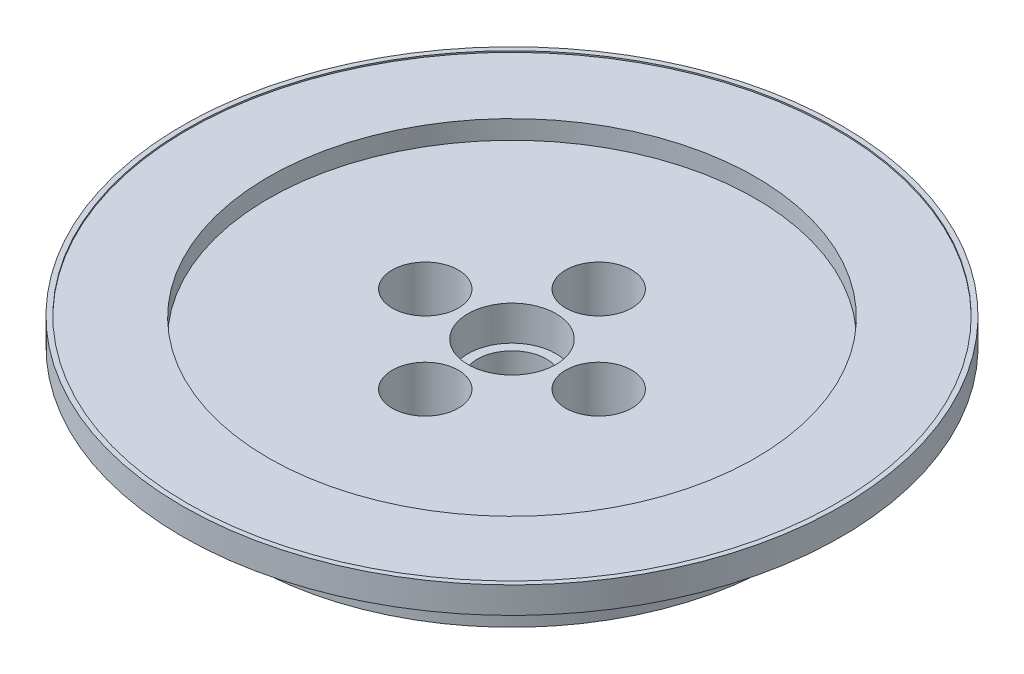
ISO-10303-21;
HEADER;
FILE_DESCRIPTION(('STEP AP214'),'2;1');
FILE_NAME('part.step','',(''),(''),'','','');
FILE_SCHEMA(('AUTOMOTIVE_DESIGN { 1 0 10303 214 1 1 1 1 }'));
ENDSEC;
DATA;
#1=APPLICATION_CONTEXT('core data for automotive mechanical design processes');
#2=APPLICATION_PROTOCOL_DEFINITION('international standard','automotive_design',2000,#1);
#3=PRODUCT_CONTEXT('',#1,'mechanical');
#4=PRODUCT('Part','Part','',(#3));
#5=PRODUCT_RELATED_PRODUCT_CATEGORY('part','',(#4));
#6=PRODUCT_DEFINITION_FORMATION('','',#4);
#7=PRODUCT_DEFINITION_CONTEXT('part definition',#1,'design');
#8=PRODUCT_DEFINITION('design','',#6,#7);
#9=PRODUCT_DEFINITION_SHAPE('','',#8);
#10=(LENGTH_UNIT() NAMED_UNIT(*) SI_UNIT(.MILLI.,.METRE.));
#11=(NAMED_UNIT(*) PLANE_ANGLE_UNIT() SI_UNIT($,.RADIAN.));
#12=(NAMED_UNIT(*) SI_UNIT($,.STERADIAN.) SOLID_ANGLE_UNIT());
#13=UNCERTAINTY_MEASURE_WITH_UNIT(LENGTH_MEASURE(1.E-05),#10,'distance_accuracy_value','');
#14=(GEOMETRIC_REPRESENTATION_CONTEXT(3) GLOBAL_UNCERTAINTY_ASSIGNED_CONTEXT((#13)) GLOBAL_UNIT_ASSIGNED_CONTEXT((#10,
#11,#12)) REPRESENTATION_CONTEXT('',''));
#15=CARTESIAN_POINT('',(0.,0.,0.));
#16=DIRECTION('',(0.,0.,1.));
#17=DIRECTION('',(1.,0.,0.));
#18=AXIS2_PLACEMENT_3D('',#15,#16,#17);
#19=CARTESIAN_POINT('',(0.,0.,0.));
#20=DIRECTION('',(0.,1.,0.));
#21=DIRECTION('',(0.,0.,1.));
#22=AXIS2_PLACEMENT_3D('',#19,#20,#21);
#23=CYLINDRICAL_SURFACE('',#22,46.798);
#24=CARTESIAN_POINT('',(0.,0.,0.));
#25=DIRECTION('',(0.,1.,0.));
#26=DIRECTION('',(0.,0.,1.));
#27=AXIS2_PLACEMENT_3D('',#24,#25,#26);
#28=CIRCLE('',#27,46.798);
#29=CARTESIAN_POINT('',(0.,0.,46.798));
#30=VERTEX_POINT('',#29);
#31=EDGE_CURVE('E18',#30,#30,#28,.F.);
#32=ORIENTED_EDGE('',*,*,#31,.F.);
#33=EDGE_LOOP('',(#32));
#34=FACE_BOUND('',#33,.T.);
#35=CARTESIAN_POINT('',(0.,-0.2,0.));
#36=DIRECTION('',(0.,1.,0.));
#37=DIRECTION('',(0.,0.,1.));
#38=AXIS2_PLACEMENT_3D('',#35,#36,#37);
#39=CIRCLE('',#38,46.798);
#40=CARTESIAN_POINT('',(0.,-0.2,46.798));
#41=VERTEX_POINT('',#40);
#42=EDGE_CURVE('E74',#41,#41,#39,.T.);
#43=ORIENTED_EDGE('',*,*,#42,.F.);
#44=EDGE_LOOP('',(#43));
#45=FACE_BOUND('',#44,.T.);
#46=ADVANCED_FACE('F15',(#34,#45),#23,.F.);
#47=CARTESIAN_POINT('',(0.,0.,0.));
#48=DIRECTION('',(0.,1.,0.));
#49=DIRECTION('',(0.,0.,1.));
#50=AXIS2_PLACEMENT_3D('',#47,#48,#49);
#51=PLANE('',#50);
#52=ORIENTED_EDGE('',*,*,#31,.T.);
#53=EDGE_LOOP('',(#52));
#54=FACE_BOUND('',#53,.T.);
#55=CARTESIAN_POINT('',(0.,0.,0.));
#56=DIRECTION('',(0.,1.,0.));
#57=DIRECTION('',(0.,0.,1.));
#58=AXIS2_PLACEMENT_3D('',#55,#56,#57);
#59=CIRCLE('',#58,47.498);
#60=CARTESIAN_POINT('',(0.,0.,47.498));
#61=VERTEX_POINT('',#60);
#62=EDGE_CURVE('E72',#61,#61,#59,.F.);
#63=ORIENTED_EDGE('',*,*,#62,.F.);
#64=EDGE_LOOP('',(#63));
#65=FACE_BOUND('',#64,.T.);
#66=ADVANCED_FACE('F81',(#54,#65),#51,.T.);
#67=CARTESIAN_POINT('',(0.,-0.2,0.));
#68=DIRECTION('',(0.,1.,0.));
#69=DIRECTION('',(0.,0.,1.));
#70=AXIS2_PLACEMENT_3D('',#67,#68,#69);
#71=PLANE('',#70);
#72=CARTESIAN_POINT('',(0.,-0.2,0.));
#73=DIRECTION('',(0.,1.,0.));
#74=DIRECTION('',(0.,0.,1.));
#75=AXIS2_PLACEMENT_3D('',#72,#73,#74);
#76=CIRCLE('',#75,35.1);
#77=CARTESIAN_POINT('',(0.,-0.2,35.1));
#78=VERTEX_POINT('',#77);
#79=EDGE_CURVE('E69',#78,#78,#76,.F.);
#80=ORIENTED_EDGE('',*,*,#79,.T.);
#81=EDGE_LOOP('',(#80));
#82=FACE_BOUND('',#81,.T.);
#83=ORIENTED_EDGE('',*,*,#42,.T.);
#84=EDGE_LOOP('',(#83));
#85=FACE_BOUND('',#84,.T.);
#86=ADVANCED_FACE('F90',(#82,#85),#71,.T.);
#87=CARTESIAN_POINT('',(0.,0.,0.));
#88=DIRECTION('',(0.,1.,0.));
#89=DIRECTION('',(0.,0.,1.));
#90=AXIS2_PLACEMENT_3D('',#87,#88,#89);
#91=CYLINDRICAL_SURFACE('',#90,47.498);
#92=ORIENTED_EDGE('',*,*,#62,.T.);
#93=EDGE_LOOP('',(#92));
#94=FACE_BOUND('',#93,.T.);
#95=CARTESIAN_POINT('',(0.,-3.80999999999902,0.));
#96=DIRECTION('',(0.,1.,0.));
#97=DIRECTION('',(0.,0.,-1.));
#98=AXIS2_PLACEMENT_3D('',#95,#96,#97);
#99=CIRCLE('',#98,47.4979999999996);
#100=CARTESIAN_POINT('',(0.,-3.80999999999902,-47.4979999999996));
#101=VERTEX_POINT('',#100);
#102=EDGE_CURVE('E30',#101,#101,#99,.F.);
#103=ORIENTED_EDGE('',*,*,#102,.F.);
#104=EDGE_LOOP('',(#103));
#105=FACE_BOUND('',#104,.T.);
#106=ADVANCED_FACE('F142',(#94,#105),#91,.T.);
#107=CARTESIAN_POINT('',(0.,0.,0.));
#108=DIRECTION('',(0.,1.,0.));
#109=DIRECTION('',(0.,0.,1.));
#110=AXIS2_PLACEMENT_3D('',#107,#108,#109);
#111=CYLINDRICAL_SURFACE('',#110,35.1);
#112=ORIENTED_EDGE('',*,*,#79,.F.);
#113=EDGE_LOOP('',(#112));
#114=FACE_BOUND('',#113,.T.);
#115=CARTESIAN_POINT('',(0.,-2.9,0.));
#116=DIRECTION('',(0.,1.,0.));
#117=DIRECTION('',(0.,0.,1.));
#118=AXIS2_PLACEMENT_3D('',#115,#116,#117);
#119=CIRCLE('',#118,35.1);
#120=CARTESIAN_POINT('',(0.,-2.9,35.1));
#121=VERTEX_POINT('',#120);
#122=EDGE_CURVE('E66',#121,#121,#119,.T.);
#123=ORIENTED_EDGE('',*,*,#122,.F.);
#124=EDGE_LOOP('',(#123));
#125=FACE_BOUND('',#124,.T.);
#126=ADVANCED_FACE('F138',(#114,#125),#111,.F.);
#127=CARTESIAN_POINT('',(0.,-1.396,0.));
#128=DIRECTION('',(0.,-1.,0.));
#129=DIRECTION('',(0.,0.,-1.));
#130=AXIS2_PLACEMENT_3D('',#127,#128,#129);
#131=CYLINDRICAL_SURFACE('',#130,6.35);
#132=CARTESIAN_POINT('',(0.,-7.898,0.));
#133=DIRECTION('',(0.,-1.,0.));
#134=DIRECTION('',(0.,0.,-1.));
#135=AXIS2_PLACEMENT_3D('',#132,#133,#134);
#136=CIRCLE('',#135,6.35);
#137=CARTESIAN_POINT('',(0.,-7.898,-6.35));
#138=VERTEX_POINT('',#137);
#139=EDGE_CURVE('E60',#138,#138,#136,.T.);
#140=ORIENTED_EDGE('',*,*,#139,.T.);
#141=EDGE_LOOP('',(#140));
#142=FACE_BOUND('',#141,.T.);
#143=CARTESIAN_POINT('',(0.,-2.9,0.));
#144=DIRECTION('',(0.,-1.,0.));
#145=DIRECTION('',(0.,0.,-1.));
#146=AXIS2_PLACEMENT_3D('',#143,#144,#145);
#147=CIRCLE('',#146,6.35);
#148=CARTESIAN_POINT('',(0.,-2.9,-6.35));
#149=VERTEX_POINT('',#148);
#150=EDGE_CURVE('E63',#149,#149,#147,.T.);
#151=ORIENTED_EDGE('',*,*,#150,.F.);
#152=EDGE_LOOP('',(#151));
#153=FACE_BOUND('',#152,.T.);
#154=ADVANCED_FACE('F134',(#142,#153),#131,.F.);
#155=CARTESIAN_POINT('',(0.,-3.80999999999902,0.));
#156=DIRECTION('',(0.,1.,0.));
#157=DIRECTION('',(0.,0.,1.));
#158=AXIS2_PLACEMENT_3D('',#155,#156,#157);
#159=CONICAL_SURFACE('',#158,47.4979999999996,1.2217304763958);
#160=ORIENTED_EDGE('',*,*,#102,.T.);
#161=EDGE_LOOP('',(#160));
#162=FACE_BOUND('',#161,.T.);
#163=CARTESIAN_POINT('',(0.,-7.230592261634,0.));
#164=DIRECTION('',(0.,1.,0.));
#165=DIRECTION('',(0.,0.,1.));
#166=AXIS2_PLACEMENT_3D('',#163,#164,#165);
#167=CIRCLE('',#166,38.1);
#168=CARTESIAN_POINT('',(0.,-7.230592261634,38.1));
#169=VERTEX_POINT('',#168);
#170=EDGE_CURVE('E59',#169,#169,#167,.F.);
#171=ORIENTED_EDGE('',*,*,#170,.F.);
#172=EDGE_LOOP('',(#171));
#173=FACE_BOUND('',#172,.T.);
#174=ADVANCED_FACE('F130',(#162,#173),#159,.T.);
#175=CARTESIAN_POINT('',(0.,-2.9,0.));
#176=DIRECTION('',(0.,1.,0.));
#177=DIRECTION('',(0.,0.,1.));
#178=AXIS2_PLACEMENT_3D('',#175,#176,#177);
#179=PLANE('',#178);
#180=ORIENTED_EDGE('',*,*,#150,.T.);
#181=EDGE_LOOP('',(#180));
#182=FACE_BOUND('',#181,.T.);
#183=CARTESIAN_POINT('',(-12.5,-2.9,0.));
#184=DIRECTION('',(0.,1.,0.));
#185=DIRECTION('',(0.,0.,1.));
#186=AXIS2_PLACEMENT_3D('',#183,#184,#185);
#187=CIRCLE('',#186,4.7625);
#188=CARTESIAN_POINT('',(-12.5,-2.9,4.7625));
#189=VERTEX_POINT('',#188);
#190=EDGE_CURVE('E47',#189,#189,#187,.F.);
#191=ORIENTED_EDGE('',*,*,#190,.T.);
#192=EDGE_LOOP('',(#191));
#193=FACE_BOUND('',#192,.T.);
#194=CARTESIAN_POINT('',(0.,-2.9,-12.5));
#195=DIRECTION('',(0.,1.,0.));
#196=DIRECTION('',(0.,0.,1.));
#197=AXIS2_PLACEMENT_3D('',#194,#195,#196);
#198=CIRCLE('',#197,4.7625);
#199=CARTESIAN_POINT('',(0.,-2.9,-7.7375));
#200=VERTEX_POINT('',#199);
#201=EDGE_CURVE('E50',#200,#200,#198,.F.);
#202=ORIENTED_EDGE('',*,*,#201,.T.);
#203=EDGE_LOOP('',(#202));
#204=FACE_BOUND('',#203,.T.);
#205=CARTESIAN_POINT('',(12.5,-2.9,0.));
#206=DIRECTION('',(0.,1.,0.));
#207=DIRECTION('',(0.,0.,1.));
#208=AXIS2_PLACEMENT_3D('',#205,#206,#207);
#209=CIRCLE('',#208,4.7625);
#210=CARTESIAN_POINT('',(12.5,-2.9,4.7625));
#211=VERTEX_POINT('',#210);
#212=EDGE_CURVE('E53',#211,#211,#209,.F.);
#213=ORIENTED_EDGE('',*,*,#212,.T.);
#214=EDGE_LOOP('',(#213));
#215=FACE_BOUND('',#214,.T.);
#216=CARTESIAN_POINT('',(0.,-2.9,12.5));
#217=DIRECTION('',(0.,1.,0.));
#218=DIRECTION('',(0.,0.,1.));
#219=AXIS2_PLACEMENT_3D('',#216,#217,#218);
#220=CIRCLE('',#219,4.7625);
#221=CARTESIAN_POINT('',(0.,-2.9,17.2625));
#222=VERTEX_POINT('',#221);
#223=EDGE_CURVE('E56',#222,#222,#220,.F.);
#224=ORIENTED_EDGE('',*,*,#223,.T.);
#225=EDGE_LOOP('',(#224));
#226=FACE_BOUND('',#225,.T.);
#227=ORIENTED_EDGE('',*,*,#122,.T.);
#228=EDGE_LOOP('',(#227));
#229=FACE_BOUND('',#228,.T.);
#230=ADVANCED_FACE('F126',(#182,#193,#204,#215,#226,#229),#179,.T.);
#231=CARTESIAN_POINT('',(0.,-7.898,0.));
#232=DIRECTION('',(0.,-1.,0.));
#233=DIRECTION('',(0.,0.,-1.));
#234=AXIS2_PLACEMENT_3D('',#231,#232,#233);
#235=PLANE('',#234);
#236=CARTESIAN_POINT('',(0.,-7.898,0.));
#237=DIRECTION('',(0.,-1.,0.));
#238=DIRECTION('',(0.,0.,-1.));
#239=AXIS2_PLACEMENT_3D('',#236,#237,#238);
#240=CIRCLE('',#239,5.);
#241=CARTESIAN_POINT('',(0.,-7.898,-5.));
#242=VERTEX_POINT('',#241);
#243=EDGE_CURVE('E44',#242,#242,#240,.T.);
#244=ORIENTED_EDGE('',*,*,#243,.T.);
#245=EDGE_LOOP('',(#244));
#246=FACE_BOUND('',#245,.T.);
#247=ORIENTED_EDGE('',*,*,#139,.F.);
#248=EDGE_LOOP('',(#247));
#249=FACE_BOUND('',#248,.T.);
#250=ADVANCED_FACE('F122',(#246,#249),#235,.F.);
#251=CARTESIAN_POINT('',(0.,0.,0.));
#252=DIRECTION('',(0.,1.,0.));
#253=DIRECTION('',(0.,0.,1.));
#254=AXIS2_PLACEMENT_3D('',#251,#252,#253);
#255=CYLINDRICAL_SURFACE('',#254,38.1);
#256=ORIENTED_EDGE('',*,*,#170,.T.);
#257=EDGE_LOOP('',(#256));
#258=FACE_BOUND('',#257,.T.);
#259=CARTESIAN_POINT('',(0.,-11.938,0.));
#260=DIRECTION('',(0.,1.,0.));
#261=DIRECTION('',(0.,0.,1.));
#262=AXIS2_PLACEMENT_3D('',#259,#260,#261);
#263=CIRCLE('',#262,38.1);
#264=CARTESIAN_POINT('',(0.,-11.938,38.1));
#265=VERTEX_POINT('',#264);
#266=EDGE_CURVE('E41',#265,#265,#263,.T.);
#267=ORIENTED_EDGE('',*,*,#266,.T.);
#268=EDGE_LOOP('',(#267));
#269=FACE_BOUND('',#268,.T.);
#270=ADVANCED_FACE('F118',(#258,#269),#255,.T.);
#271=CARTESIAN_POINT('',(0.,-11.938,12.5));
#272=DIRECTION('',(0.,1.,0.));
#273=DIRECTION('',(0.,0.,1.));
#274=AXIS2_PLACEMENT_3D('',#271,#272,#273);
#275=CYLINDRICAL_SURFACE('',#274,4.7625);
#276=ORIENTED_EDGE('',*,*,#223,.F.);
#277=EDGE_LOOP('',(#276));
#278=FACE_BOUND('',#277,.T.);
#279=CARTESIAN_POINT('',(0.,-11.938,12.5));
#280=DIRECTION('',(0.,1.,0.));
#281=DIRECTION('',(0.,0.,1.));
#282=AXIS2_PLACEMENT_3D('',#279,#280,#281);
#283=CIRCLE('',#282,4.7625);
#284=CARTESIAN_POINT('',(0.,-11.938,17.2625));
#285=VERTEX_POINT('',#284);
#286=EDGE_CURVE('E38',#285,#285,#283,.F.);
#287=ORIENTED_EDGE('',*,*,#286,.T.);
#288=EDGE_LOOP('',(#287));
#289=FACE_BOUND('',#288,.T.);
#290=ADVANCED_FACE('F114',(#278,#289),#275,.F.);
#291=CARTESIAN_POINT('',(12.5,-11.938,0.));
#292=DIRECTION('',(0.,1.,0.));
#293=DIRECTION('',(0.,0.,1.));
#294=AXIS2_PLACEMENT_3D('',#291,#292,#293);
#295=CYLINDRICAL_SURFACE('',#294,4.7625);
#296=ORIENTED_EDGE('',*,*,#212,.F.);
#297=EDGE_LOOP('',(#296));
#298=FACE_BOUND('',#297,.T.);
#299=CARTESIAN_POINT('',(12.5,-11.938,0.));
#300=DIRECTION('',(0.,1.,0.));
#301=DIRECTION('',(0.,0.,1.));
#302=AXIS2_PLACEMENT_3D('',#299,#300,#301);
#303=CIRCLE('',#302,4.7625);
#304=CARTESIAN_POINT('',(12.5,-11.938,4.7625));
#305=VERTEX_POINT('',#304);
#306=EDGE_CURVE('E35',#305,#305,#303,.F.);
#307=ORIENTED_EDGE('',*,*,#306,.T.);
#308=EDGE_LOOP('',(#307));
#309=FACE_BOUND('',#308,.T.);
#310=ADVANCED_FACE('F110',(#298,#309),#295,.F.);
#311=CARTESIAN_POINT('',(0.,-11.938,-12.5));
#312=DIRECTION('',(0.,1.,0.));
#313=DIRECTION('',(0.,0.,1.));
#314=AXIS2_PLACEMENT_3D('',#311,#312,#313);
#315=CYLINDRICAL_SURFACE('',#314,4.7625);
#316=ORIENTED_EDGE('',*,*,#201,.F.);
#317=EDGE_LOOP('',(#316));
#318=FACE_BOUND('',#317,.T.);
#319=CARTESIAN_POINT('',(0.,-11.938,-12.5));
#320=DIRECTION('',(0.,1.,0.));
#321=DIRECTION('',(0.,0.,1.));
#322=AXIS2_PLACEMENT_3D('',#319,#320,#321);
#323=CIRCLE('',#322,4.7625);
#324=CARTESIAN_POINT('',(0.,-11.938,-7.7375));
#325=VERTEX_POINT('',#324);
#326=EDGE_CURVE('E27',#325,#325,#323,.F.);
#327=ORIENTED_EDGE('',*,*,#326,.T.);
#328=EDGE_LOOP('',(#327));
#329=FACE_BOUND('',#328,.T.);
#330=ADVANCED_FACE('F106',(#318,#329),#315,.F.);
#331=CARTESIAN_POINT('',(-12.5,-11.938,0.));
#332=DIRECTION('',(0.,1.,0.));
#333=DIRECTION('',(0.,0.,1.));
#334=AXIS2_PLACEMENT_3D('',#331,#332,#333);
#335=CYLINDRICAL_SURFACE('',#334,4.7625);
#336=ORIENTED_EDGE('',*,*,#190,.F.);
#337=EDGE_LOOP('',(#336));
#338=FACE_BOUND('',#337,.T.);
#339=CARTESIAN_POINT('',(-12.5,-11.938,0.));
#340=DIRECTION('',(0.,1.,0.));
#341=DIRECTION('',(0.,0.,1.));
#342=AXIS2_PLACEMENT_3D('',#339,#340,#341);
#343=CIRCLE('',#342,4.7625);
#344=CARTESIAN_POINT('',(-12.5,-11.938,4.7625));
#345=VERTEX_POINT('',#344);
#346=EDGE_CURVE('E22',#345,#345,#343,.F.);
#347=ORIENTED_EDGE('',*,*,#346,.T.);
#348=EDGE_LOOP('',(#347));
#349=FACE_BOUND('',#348,.T.);
#350=ADVANCED_FACE('F99',(#338,#349),#335,.F.);
#351=CARTESIAN_POINT('',(0.,-1.396,0.));
#352=DIRECTION('',(0.,-1.,0.));
#353=DIRECTION('',(0.,0.,-1.));
#354=AXIS2_PLACEMENT_3D('',#351,#352,#353);
#355=CYLINDRICAL_SURFACE('',#354,5.);
#356=ORIENTED_EDGE('',*,*,#243,.F.);
#357=EDGE_LOOP('',(#356));
#358=FACE_BOUND('',#357,.T.);
#359=CARTESIAN_POINT('',(0.,-11.938,0.));
#360=DIRECTION('',(0.,-1.,0.));
#361=DIRECTION('',(0.,0.,-1.));
#362=AXIS2_PLACEMENT_3D('',#359,#360,#361);
#363=CIRCLE('',#362,5.);
#364=CARTESIAN_POINT('',(0.,-11.938,-5.));
#365=VERTEX_POINT('',#364);
#366=EDGE_CURVE('E10',#365,#365,#363,.T.);
#367=ORIENTED_EDGE('',*,*,#366,.T.);
#368=EDGE_LOOP('',(#367));
#369=FACE_BOUND('',#368,.T.);
#370=ADVANCED_FACE('F93',(#358,#369),#355,.F.);
#371=CARTESIAN_POINT('',(0.,-11.938,0.));
#372=DIRECTION('',(0.,1.,0.));
#373=DIRECTION('',(0.,0.,1.));
#374=AXIS2_PLACEMENT_3D('',#371,#372,#373);
#375=PLANE('',#374);
#376=ORIENTED_EDGE('',*,*,#366,.F.);
#377=EDGE_LOOP('',(#376));
#378=FACE_BOUND('',#377,.T.);
#379=ORIENTED_EDGE('',*,*,#346,.F.);
#380=EDGE_LOOP('',(#379));
#381=FACE_BOUND('',#380,.T.);
#382=ORIENTED_EDGE('',*,*,#326,.F.);
#383=EDGE_LOOP('',(#382));
#384=FACE_BOUND('',#383,.T.);
#385=ORIENTED_EDGE('',*,*,#306,.F.);
#386=EDGE_LOOP('',(#385));
#387=FACE_BOUND('',#386,.T.);
#388=ORIENTED_EDGE('',*,*,#286,.F.);
#389=EDGE_LOOP('',(#388));
#390=FACE_BOUND('',#389,.T.);
#391=ORIENTED_EDGE('',*,*,#266,.F.);
#392=EDGE_LOOP('',(#391));
#393=FACE_BOUND('',#392,.T.);
#394=ADVANCED_FACE('F91',(#378,#381,#384,#387,#390,#393),#375,.F.);
#395=CLOSED_SHELL('',(#46,#66,#86,#106,#126,#154,#174,#230,#250,#270,#290,#310,#330,#350,#370,#394));
#396=MANIFOLD_SOLID_BREP('B1',#395);
#397=ADVANCED_BREP_SHAPE_REPRESENTATION('',(#18,#396),#14);
#398=SHAPE_DEFINITION_REPRESENTATION(#9,#397);
ENDSEC;
END-ISO-10303-21;
